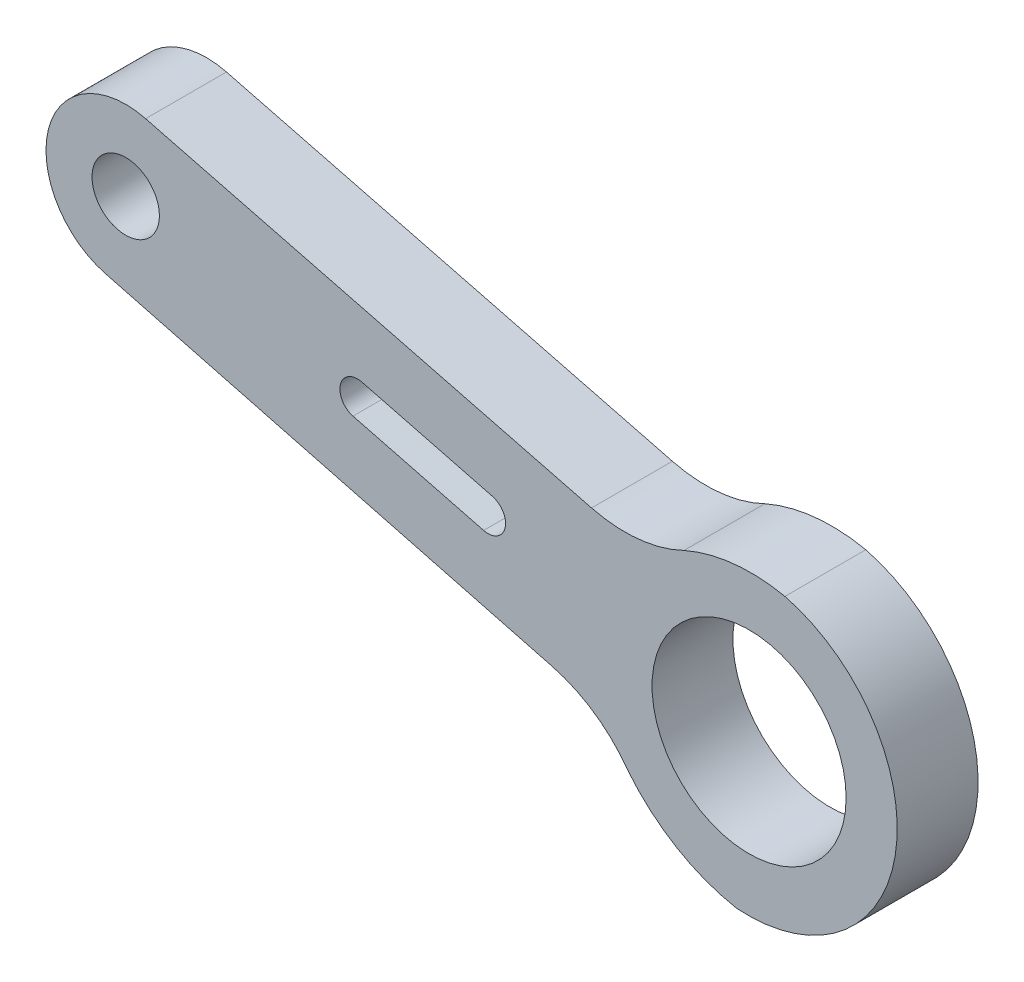
ISO-10303-21;
HEADER;
FILE_DESCRIPTION(('STEP AP214'),'2;1');
FILE_NAME('part.step','',(''),(''),'','','');
FILE_SCHEMA(('AUTOMOTIVE_DESIGN { 1 0 10303 214 1 1 1 1 }'));
ENDSEC;
DATA;
#1=APPLICATION_CONTEXT('core data for automotive mechanical design processes');
#2=APPLICATION_PROTOCOL_DEFINITION('international standard','automotive_design',2000,#1);
#3=PRODUCT_CONTEXT('',#1,'mechanical');
#4=PRODUCT('Part','Part','',(#3));
#5=PRODUCT_RELATED_PRODUCT_CATEGORY('part','',(#4));
#6=PRODUCT_DEFINITION_FORMATION('','',#4);
#7=PRODUCT_DEFINITION_CONTEXT('part definition',#1,'design');
#8=PRODUCT_DEFINITION('design','',#6,#7);
#9=PRODUCT_DEFINITION_SHAPE('','',#8);
#10=(LENGTH_UNIT() NAMED_UNIT(*) SI_UNIT(.MILLI.,.METRE.));
#11=(NAMED_UNIT(*) PLANE_ANGLE_UNIT() SI_UNIT($,.RADIAN.));
#12=(NAMED_UNIT(*) SI_UNIT($,.STERADIAN.) SOLID_ANGLE_UNIT());
#13=UNCERTAINTY_MEASURE_WITH_UNIT(LENGTH_MEASURE(1.E-05),#10,'distance_accuracy_value','');
#14=(GEOMETRIC_REPRESENTATION_CONTEXT(3) GLOBAL_UNCERTAINTY_ASSIGNED_CONTEXT((#13)) GLOBAL_UNIT_ASSIGNED_CONTEXT((#10,
#11,#12)) REPRESENTATION_CONTEXT('',''));
#15=CARTESIAN_POINT('',(0.,0.,0.));
#16=DIRECTION('',(0.,0.,1.));
#17=DIRECTION('',(1.,0.,0.));
#18=AXIS2_PLACEMENT_3D('',#15,#16,#17);
#19=CARTESIAN_POINT('',(262.893149615823,85.3209545811393,3.));
#20=DIRECTION('',(0.,0.,1.));
#21=DIRECTION('',(1.,0.,0.));
#22=AXIS2_PLACEMENT_3D('',#19,#20,#21);
#23=PLANE('',#22);
#24=DIRECTION('',(0.968336228734714,-0.249649650750469,0.));
#25=VECTOR('',#24,1.);
#26=CARTESIAN_POINT('',(252.804001409949,79.0029027766564,3.));
#27=LINE('',#26,#25);
#28=CARTESIAN_POINT('',(252.804001409949,79.0029027766564,3.));
#29=VERTEX_POINT('',#28);
#30=CARTESIAN_POINT('',(257.650550116745,77.7533996019402,3.));
#31=VERTEX_POINT('',#30);
#32=EDGE_CURVE('E130',#29,#31,#27,.T.);
#33=ORIENTED_EDGE('',*,*,#32,.F.);
#34=CARTESIAN_POINT('',(252.969255150284,79.6315451243434,3.));
#35=DIRECTION('',(0.,0.,1.));
#36=DIRECTION('',(1.,0.,0.));
#37=AXIS2_PLACEMENT_3D('',#34,#35,#36);
#38=CIRCLE('',#37,0.650000000000051);
#39=CARTESIAN_POINT('',(253.134508890618,80.2601874720305,3.));
#40=VERTEX_POINT('',#39);
#41=EDGE_CURVE('E122',#40,#29,#38,.T.);
#42=ORIENTED_EDGE('',*,*,#41,.F.);
#43=DIRECTION('',(-0.968336227980004,0.249649653677824,0.));
#44=VECTOR('',#43,1.);
#45=CARTESIAN_POINT('',(257.981059368998,79.0106838249517,3.));
#46=LINE('',#45,#44);
#47=CARTESIAN_POINT('',(257.981059368998,79.0106838249517,3.));
#48=VERTEX_POINT('',#47);
#49=EDGE_CURVE('E145',#48,#40,#46,.T.);
#50=ORIENTED_EDGE('',*,*,#49,.F.);
#51=CARTESIAN_POINT('',(257.815804742871,78.382041713446,3.));
#52=DIRECTION('',(0.,0.,1.));
#53=DIRECTION('',(1.,0.,0.));
#54=AXIS2_PLACEMENT_3D('',#51,#52,#53);
#55=CIRCLE('',#54,0.649999996780456);
#56=EDGE_CURVE('E143',#31,#48,#55,.T.);
#57=ORIENTED_EDGE('',*,*,#56,.F.);
#58=EDGE_LOOP('',(#33,#42,#50,#57));
#59=FACE_BOUND('',#58,.T.);
#60=CARTESIAN_POINT('',(267.499543018167,75.8854306088731,3.));
#61=DIRECTION('',(0.,0.,1.));
#62=DIRECTION('',(1.,0.,0.));
#63=AXIS2_PLACEMENT_3D('',#60,#61,#62);
#64=CIRCLE('',#63,3.60000000000001);
#65=CARTESIAN_POINT('',(271.099543018167,75.8854306088731,3.));
#66=VERTEX_POINT('',#65);
#67=EDGE_CURVE('E161',#66,#66,#64,.T.);
#68=ORIENTED_EDGE('',*,*,#67,.F.);
#69=EDGE_LOOP('',(#68));
#70=FACE_BOUND('',#69,.T.);
#71=CARTESIAN_POINT('',(262.893149615823,85.3209545811393,3.));
#72=DIRECTION('',(0.,0.,-1.));
#73=DIRECTION('',(1.,0.,0.));
#74=AXIS2_PLACEMENT_3D('',#71,#72,#73);
#75=CIRCLE('',#74,4.99988028430356);
#76=CARTESIAN_POINT('',(265.086550742752,80.8278716357938,3.));
#77=VERTEX_POINT('',#76);
#78=CARTESIAN_POINT('',(261.654207062286,80.4770074090076,3.));
#79=VERTEX_POINT('',#78);
#80=EDGE_CURVE('E167',#77,#79,#75,.T.);
#81=ORIENTED_EDGE('',*,*,#80,.T.);
#82=DIRECTION('',(-0.968768932380631,0.24796523073627,0.));
#83=VECTOR('',#82,1.);
#84=CARTESIAN_POINT('',(261.654207062286,80.4770074090076,3.));
#85=LINE('',#84,#83);
#86=CARTESIAN_POINT('',(245.112048776645,84.7111234701976,3.));
#87=VERTEX_POINT('',#86);
#88=EDGE_CURVE('E170',#79,#87,#85,.T.);
#89=ORIENTED_EDGE('',*,*,#88,.T.);
#90=CARTESIAN_POINT('',(244.373787068958,81.8475684181407,3.));
#91=DIRECTION('',(0.,0.,1.));
#92=DIRECTION('',(-1.,0.,0.));
#93=AXIS2_PLACEMENT_3D('',#90,#91,#92);
#94=CIRCLE('',#93,2.95719087736943);
#95=CARTESIAN_POINT('',(243.63552469051,78.984013539015,3.));
#96=VERTEX_POINT('',#95);
#97=EDGE_CURVE('E173',#87,#96,#94,.T.);
#98=ORIENTED_EDGE('',*,*,#97,.T.);
#99=DIRECTION('',(0.967514162567297,-0.252816821496717,0.));
#100=VECTOR('',#99,1.);
#101=CARTESIAN_POINT('',(243.63552469051,78.984013539015,3.));
#102=LINE('',#101,#100);
#103=CARTESIAN_POINT('',(260.167543030857,74.6641053749409,3.));
#104=VERTEX_POINT('',#103);
#105=EDGE_CURVE('E175',#96,#104,#102,.T.);
#106=ORIENTED_EDGE('',*,*,#105,.T.);
#107=CARTESIAN_POINT('',(258.928599023242,69.8200585315925,3.));
#108=DIRECTION('',(0.,0.,-1.));
#109=DIRECTION('',(1.,0.,0.));
#110=AXIS2_PLACEMENT_3D('',#107,#108,#109);
#111=CIRCLE('',#110,4.99997720740361);
#112=CARTESIAN_POINT('',(263.00998110044,72.7083265964513,3.));
#113=VERTEX_POINT('',#112);
#114=EDGE_CURVE('E177',#104,#113,#111,.T.);
#115=ORIENTED_EDGE('',*,*,#114,.T.);
#116=CARTESIAN_POINT('',(268.27348849085,76.951992882265,3.));
#117=DIRECTION('',(0.,0.,1.));
#118=DIRECTION('',(1.,0.,0.));
#119=AXIS2_PLACEMENT_3D('',#116,#117,#118);
#120=CIRCLE('',#119,6.7611547530171);
#121=CARTESIAN_POINT('',(267.027735224083,70.306595046726,3.));
#122=VERTEX_POINT('',#121);
#123=EDGE_CURVE('E179',#113,#122,#120,.T.);
#124=ORIENTED_EDGE('',*,*,#123,.T.);
#125=CARTESIAN_POINT('',(267.441397071041,75.8448272787794,3.));
#126=DIRECTION('',(0.,0.,1.));
#127=DIRECTION('',(1.,0.,0.));
#128=AXIS2_PLACEMENT_3D('',#125,#126,#127);
#129=CIRCLE('',#128,5.55365936836099);
#130=CARTESIAN_POINT('',(268.830075410294,81.2220660654592,3.));
#131=VERTEX_POINT('',#130);
#132=EDGE_CURVE('E181',#122,#131,#129,.T.);
#133=ORIENTED_EDGE('',*,*,#132,.T.);
#134=CARTESIAN_POINT('',(267.568291859667,75.2322167223997,3.));
#135=DIRECTION('',(0.,0.,1.));
#136=DIRECTION('',(1.,0.,0.));
#137=AXIS2_PLACEMENT_3D('',#134,#135,#136);
#138=CIRCLE('',#137,6.12130646849034);
#139=EDGE_CURVE('E183',#131,#77,#138,.T.);
#140=ORIENTED_EDGE('',*,*,#139,.T.);
#141=EDGE_LOOP('',(#81,#89,#98,#106,#115,#124,#133,#140));
#142=FACE_BOUND('',#141,.T.);
#143=CARTESIAN_POINT('',(244.373787095024,81.8475683954791,3.));
#144=DIRECTION('',(0.,0.,1.));
#145=DIRECTION('',(1.,0.,0.));
#146=AXIS2_PLACEMENT_3D('',#143,#144,#145);
#147=CIRCLE('',#146,1.25000000000001);
#148=CARTESIAN_POINT('',(245.623787095024,81.8475683954791,3.));
#149=VERTEX_POINT('',#148);
#150=EDGE_CURVE('E151',#149,#149,#147,.T.);
#151=ORIENTED_EDGE('',*,*,#150,.F.);
#152=EDGE_LOOP('',(#151));
#153=FACE_BOUND('',#152,.T.);
#154=ADVANCED_FACE('F33',(#59,#70,#142,#153),#23,.T.);
#155=CARTESIAN_POINT('',(262.893149615823,85.3209545811393,0.));
#156=DIRECTION('',(0.,0.,1.));
#157=DIRECTION('',(1.,0.,0.));
#158=AXIS2_PLACEMENT_3D('',#155,#156,#157);
#159=PLANE('',#158);
#160=CARTESIAN_POINT('',(267.499543018167,75.8854306088731,0.));
#161=DIRECTION('',(0.,0.,1.));
#162=DIRECTION('',(1.,0.,0.));
#163=AXIS2_PLACEMENT_3D('',#160,#161,#162);
#164=CIRCLE('',#163,3.60000000000001);
#165=CARTESIAN_POINT('',(271.099543018167,75.8854306088731,0.));
#166=VERTEX_POINT('',#165);
#167=EDGE_CURVE('E138',#166,#166,#164,.T.);
#168=ORIENTED_EDGE('',*,*,#167,.T.);
#169=EDGE_LOOP('',(#168));
#170=FACE_BOUND('',#169,.T.);
#171=CARTESIAN_POINT('',(262.893149615823,85.3209545811393,0.));
#172=DIRECTION('',(0.,0.,-1.));
#173=DIRECTION('',(1.,0.,0.));
#174=AXIS2_PLACEMENT_3D('',#171,#172,#173);
#175=CIRCLE('',#174,4.99988028430356);
#176=CARTESIAN_POINT('',(265.086550742752,80.8278716357938,0.));
#177=VERTEX_POINT('',#176);
#178=CARTESIAN_POINT('',(261.654207062286,80.4770074090076,0.));
#179=VERTEX_POINT('',#178);
#180=EDGE_CURVE('E164',#177,#179,#175,.T.);
#181=ORIENTED_EDGE('',*,*,#180,.F.);
#182=CARTESIAN_POINT('',(267.568291859667,75.2322167223997,0.));
#183=DIRECTION('',(0.,0.,1.));
#184=DIRECTION('',(1.,0.,0.));
#185=AXIS2_PLACEMENT_3D('',#182,#183,#184);
#186=CIRCLE('',#185,6.12130646849034);
#187=CARTESIAN_POINT('',(268.830075410294,81.2220660654592,0.));
#188=VERTEX_POINT('',#187);
#189=EDGE_CURVE('E171',#188,#177,#186,.T.);
#190=ORIENTED_EDGE('',*,*,#189,.F.);
#191=CARTESIAN_POINT('',(267.441397085972,75.8448269153171,0.));
#192=DIRECTION('',(0.,0.,1.));
#193=DIRECTION('',(-1.,0.,0.));
#194=AXIS2_PLACEMENT_3D('',#191,#192,#193);
#195=CIRCLE('',#194,5.55365900702066);
#196=CARTESIAN_POINT('',(267.027735224083,70.306595046726,0.));
#197=VERTEX_POINT('',#196);
#198=EDGE_CURVE('E199',#197,#188,#195,.T.);
#199=ORIENTED_EDGE('',*,*,#198,.F.);
#200=CARTESIAN_POINT('',(268.27348849085,76.951992882265,0.));
#201=DIRECTION('',(0.,0.,1.));
#202=DIRECTION('',(1.,0.,0.));
#203=AXIS2_PLACEMENT_3D('',#200,#201,#202);
#204=CIRCLE('',#203,6.7611547530171);
#205=CARTESIAN_POINT('',(263.00998110044,72.7083265964513,0.));
#206=VERTEX_POINT('',#205);
#207=EDGE_CURVE('E196',#206,#197,#204,.T.);
#208=ORIENTED_EDGE('',*,*,#207,.F.);
#209=CARTESIAN_POINT('',(258.928599023242,69.8200585315925,0.));
#210=DIRECTION('',(0.,0.,-1.));
#211=DIRECTION('',(1.,0.,0.));
#212=AXIS2_PLACEMENT_3D('',#209,#210,#211);
#213=CIRCLE('',#212,4.99997720740361);
#214=CARTESIAN_POINT('',(260.167543030857,74.6641053749409,0.));
#215=VERTEX_POINT('',#214);
#216=EDGE_CURVE('E194',#215,#206,#213,.T.);
#217=ORIENTED_EDGE('',*,*,#216,.F.);
#218=DIRECTION('',(0.967514162567297,-0.252816821496717,0.));
#219=VECTOR('',#218,1.);
#220=CARTESIAN_POINT('',(243.63552469051,78.984013539015,0.));
#221=LINE('',#220,#219);
#222=CARTESIAN_POINT('',(243.63552469051,78.984013539015,0.));
#223=VERTEX_POINT('',#222);
#224=EDGE_CURVE('E192',#223,#215,#221,.T.);
#225=ORIENTED_EDGE('',*,*,#224,.F.);
#226=CARTESIAN_POINT('',(244.373787068958,81.8475684181407,0.));
#227=DIRECTION('',(0.,0.,1.));
#228=DIRECTION('',(-1.,0.,0.));
#229=AXIS2_PLACEMENT_3D('',#226,#227,#228);
#230=CIRCLE('',#229,2.95719087736943);
#231=CARTESIAN_POINT('',(245.112048776645,84.7111234701976,0.));
#232=VERTEX_POINT('',#231);
#233=EDGE_CURVE('E190',#232,#223,#230,.T.);
#234=ORIENTED_EDGE('',*,*,#233,.F.);
#235=DIRECTION('',(-0.968768932380631,0.24796523073627,0.));
#236=VECTOR('',#235,1.);
#237=CARTESIAN_POINT('',(261.654207062286,80.4770074090076,0.));
#238=LINE('',#237,#236);
#239=EDGE_CURVE('E188',#179,#232,#238,.T.);
#240=ORIENTED_EDGE('',*,*,#239,.F.);
#241=EDGE_LOOP('',(#181,#190,#199,#208,#217,#225,#234,#240));
#242=FACE_BOUND('',#241,.T.);
#243=CARTESIAN_POINT('',(252.969255150284,79.6315451243434,0.));
#244=DIRECTION('',(0.,0.,1.));
#245=DIRECTION('',(1.,0.,0.));
#246=AXIS2_PLACEMENT_3D('',#243,#244,#245);
#247=CIRCLE('',#246,0.650000000000051);
#248=CARTESIAN_POINT('',(253.134508890618,80.2601874720305,0.));
#249=VERTEX_POINT('',#248);
#250=CARTESIAN_POINT('',(252.804001409949,79.0029027766564,0.));
#251=VERTEX_POINT('',#250);
#252=EDGE_CURVE('E56',#249,#251,#247,.T.);
#253=ORIENTED_EDGE('',*,*,#252,.T.);
#254=DIRECTION('',(0.968336228734714,-0.249649650750469,0.));
#255=VECTOR('',#254,1.);
#256=CARTESIAN_POINT('',(252.804001409949,79.0029027766564,0.));
#257=LINE('',#256,#255);
#258=CARTESIAN_POINT('',(257.650550116745,77.7533996019402,0.));
#259=VERTEX_POINT('',#258);
#260=EDGE_CURVE('E137',#251,#259,#257,.T.);
#261=ORIENTED_EDGE('',*,*,#260,.T.);
#262=CARTESIAN_POINT('',(257.815804742871,78.382041713446,0.));
#263=DIRECTION('',(0.,0.,1.));
#264=DIRECTION('',(1.,0.,0.));
#265=AXIS2_PLACEMENT_3D('',#262,#263,#264);
#266=CIRCLE('',#265,0.649999996780456);
#267=CARTESIAN_POINT('',(257.981059368998,79.0106838249517,0.));
#268=VERTEX_POINT('',#267);
#269=EDGE_CURVE('E153',#259,#268,#266,.T.);
#270=ORIENTED_EDGE('',*,*,#269,.T.);
#271=DIRECTION('',(-0.968336227980004,0.249649653677824,0.));
#272=VECTOR('',#271,1.);
#273=CARTESIAN_POINT('',(257.981059368998,79.0106838249517,0.));
#274=LINE('',#273,#272);
#275=EDGE_CURVE('E131',#268,#249,#274,.T.);
#276=ORIENTED_EDGE('',*,*,#275,.T.);
#277=EDGE_LOOP('',(#253,#261,#270,#276));
#278=FACE_BOUND('',#277,.T.);
#279=CARTESIAN_POINT('',(244.373787095024,81.8475683954791,0.));
#280=DIRECTION('',(0.,0.,1.));
#281=DIRECTION('',(1.,0.,0.));
#282=AXIS2_PLACEMENT_3D('',#279,#280,#281);
#283=CIRCLE('',#282,1.25000000000001);
#284=CARTESIAN_POINT('',(245.623787095024,81.8475683954791,0.));
#285=VERTEX_POINT('',#284);
#286=EDGE_CURVE('E312',#285,#285,#283,.T.);
#287=ORIENTED_EDGE('',*,*,#286,.T.);
#288=EDGE_LOOP('',(#287));
#289=FACE_BOUND('',#288,.T.);
#290=ADVANCED_FACE('F229',(#170,#242,#278,#289),#159,.F.);
#291=CARTESIAN_POINT('',(262.893149615823,85.3209545811393,3.));
#292=DIRECTION('',(0.,0.,-1.));
#293=DIRECTION('',(-1.,0.,0.));
#294=AXIS2_PLACEMENT_3D('',#291,#292,#293);
#295=CYLINDRICAL_SURFACE('',#294,4.99988028430356);
#296=ORIENTED_EDGE('',*,*,#180,.T.);
#297=DIRECTION('',(0.,0.,-1.));
#298=VECTOR('',#297,1.);
#299=CARTESIAN_POINT('',(261.654207062286,80.4770074090076,3.));
#300=LINE('',#299,#298);
#301=EDGE_CURVE('E11',#79,#179,#300,.T.);
#302=ORIENTED_EDGE('',*,*,#301,.F.);
#303=ORIENTED_EDGE('',*,*,#80,.F.);
#304=DIRECTION('',(0.,0.,-1.));
#305=VECTOR('',#304,1.);
#306=CARTESIAN_POINT('',(265.086550742752,80.8278716357938,3.));
#307=LINE('',#306,#305);
#308=EDGE_CURVE('E185',#77,#177,#307,.T.);
#309=ORIENTED_EDGE('',*,*,#308,.T.);
#310=EDGE_LOOP('',(#296,#302,#303,#309));
#311=FACE_BOUND('',#310,.T.);
#312=ADVANCED_FACE('F35',(#311),#295,.F.);
#313=CARTESIAN_POINT('',(261.654207062286,80.4770074090076,3.));
#314=DIRECTION('',(-0.24796523073627,-0.968768932380631,0.));
#315=DIRECTION('',(0.968768932380631,-0.24796523073627,0.));
#316=AXIS2_PLACEMENT_3D('',#313,#314,#315);
#317=PLANE('',#316);
#318=ORIENTED_EDGE('',*,*,#239,.T.);
#319=DIRECTION('',(0.,0.,-1.));
#320=VECTOR('',#319,1.);
#321=CARTESIAN_POINT('',(245.112048776645,84.7111234701976,3.));
#322=LINE('',#321,#320);
#323=EDGE_CURVE('E41',#87,#232,#322,.T.);
#324=ORIENTED_EDGE('',*,*,#323,.F.);
#325=ORIENTED_EDGE('',*,*,#88,.F.);
#326=ORIENTED_EDGE('',*,*,#301,.T.);
#327=EDGE_LOOP('',(#318,#324,#325,#326));
#328=FACE_BOUND('',#327,.T.);
#329=ADVANCED_FACE('F247',(#328),#317,.F.);
#330=CARTESIAN_POINT('',(244.373787068958,81.8475684181407,3.));
#331=DIRECTION('',(0.,0.,-1.));
#332=DIRECTION('',(-1.,0.,0.));
#333=AXIS2_PLACEMENT_3D('',#330,#331,#332);
#334=CYLINDRICAL_SURFACE('',#333,2.95719087736943);
#335=ORIENTED_EDGE('',*,*,#233,.T.);
#336=DIRECTION('',(0.,0.,-1.));
#337=VECTOR('',#336,1.);
#338=CARTESIAN_POINT('',(243.63552469051,78.984013539015,3.));
#339=LINE('',#338,#337);
#340=EDGE_CURVE('E216',#96,#223,#339,.T.);
#341=ORIENTED_EDGE('',*,*,#340,.F.);
#342=ORIENTED_EDGE('',*,*,#97,.F.);
#343=ORIENTED_EDGE('',*,*,#323,.T.);
#344=EDGE_LOOP('',(#335,#341,#342,#343));
#345=FACE_BOUND('',#344,.T.);
#346=ADVANCED_FACE('F223',(#345),#334,.T.);
#347=CARTESIAN_POINT('',(243.63552469051,78.984013539015,3.));
#348=DIRECTION('',(0.252816821496717,0.967514162567296,0.));
#349=DIRECTION('',(-0.967514162567297,0.252816821496717,0.));
#350=AXIS2_PLACEMENT_3D('',#347,#348,#349);
#351=PLANE('',#350);
#352=ORIENTED_EDGE('',*,*,#224,.T.);
#353=DIRECTION('',(0.,0.,-1.));
#354=VECTOR('',#353,1.);
#355=CARTESIAN_POINT('',(260.167543030857,74.6641053749409,3.));
#356=LINE('',#355,#354);
#357=EDGE_CURVE('E213',#104,#215,#356,.T.);
#358=ORIENTED_EDGE('',*,*,#357,.F.);
#359=ORIENTED_EDGE('',*,*,#105,.F.);
#360=ORIENTED_EDGE('',*,*,#340,.T.);
#361=EDGE_LOOP('',(#352,#358,#359,#360));
#362=FACE_BOUND('',#361,.T.);
#363=ADVANCED_FACE('F235',(#362),#351,.F.);
#364=CARTESIAN_POINT('',(258.928599023242,69.8200585315925,3.));
#365=DIRECTION('',(0.,0.,-1.));
#366=DIRECTION('',(-1.,0.,0.));
#367=AXIS2_PLACEMENT_3D('',#364,#365,#366);
#368=CYLINDRICAL_SURFACE('',#367,4.99997720740361);
#369=ORIENTED_EDGE('',*,*,#216,.T.);
#370=DIRECTION('',(0.,0.,-1.));
#371=VECTOR('',#370,1.);
#372=CARTESIAN_POINT('',(263.00998110044,72.7083265964513,3.));
#373=LINE('',#372,#371);
#374=EDGE_CURVE('E210',#113,#206,#373,.T.);
#375=ORIENTED_EDGE('',*,*,#374,.F.);
#376=ORIENTED_EDGE('',*,*,#114,.F.);
#377=ORIENTED_EDGE('',*,*,#357,.T.);
#378=EDGE_LOOP('',(#369,#375,#376,#377));
#379=FACE_BOUND('',#378,.T.);
#380=ADVANCED_FACE('F239',(#379),#368,.F.);
#381=CARTESIAN_POINT('',(268.27348849085,76.951992882265,3.));
#382=DIRECTION('',(0.,0.,-1.));
#383=DIRECTION('',(-1.,0.,0.));
#384=AXIS2_PLACEMENT_3D('',#381,#382,#383);
#385=CYLINDRICAL_SURFACE('',#384,6.7611547530171);
#386=ORIENTED_EDGE('',*,*,#207,.T.);
#387=DIRECTION('',(0.,0.,-1.));
#388=VECTOR('',#387,1.);
#389=CARTESIAN_POINT('',(267.027735224083,70.306595046726,3.));
#390=LINE('',#389,#388);
#391=EDGE_CURVE('E207',#122,#197,#390,.T.);
#392=ORIENTED_EDGE('',*,*,#391,.F.);
#393=ORIENTED_EDGE('',*,*,#123,.F.);
#394=ORIENTED_EDGE('',*,*,#374,.T.);
#395=EDGE_LOOP('',(#386,#392,#393,#394));
#396=FACE_BOUND('',#395,.T.);
#397=ADVANCED_FACE('F259',(#396),#385,.T.);
#398=CARTESIAN_POINT('',(267.441397085972,75.8448269153171,3.));
#399=DIRECTION('',(0.,0.,-1.));
#400=DIRECTION('',(-1.,0.,0.));
#401=AXIS2_PLACEMENT_3D('',#398,#399,#400);
#402=CYLINDRICAL_SURFACE('',#401,5.55365900702066);
#403=ORIENTED_EDGE('',*,*,#198,.T.);
#404=DIRECTION('',(0.,0.,-1.));
#405=VECTOR('',#404,1.);
#406=CARTESIAN_POINT('',(268.830075410294,81.2220660654592,3.));
#407=LINE('',#406,#405);
#408=EDGE_CURVE('E204',#131,#188,#407,.T.);
#409=ORIENTED_EDGE('',*,*,#408,.F.);
#410=ORIENTED_EDGE('',*,*,#132,.F.);
#411=ORIENTED_EDGE('',*,*,#391,.T.);
#412=EDGE_LOOP('',(#403,#409,#410,#411));
#413=FACE_BOUND('',#412,.T.);
#414=ADVANCED_FACE('F257',(#413),#402,.T.);
#415=CARTESIAN_POINT('',(267.568291859667,75.2322167223997,3.));
#416=DIRECTION('',(0.,0.,-1.));
#417=DIRECTION('',(-1.,0.,0.));
#418=AXIS2_PLACEMENT_3D('',#415,#416,#417);
#419=CYLINDRICAL_SURFACE('',#418,6.12130646849034);
#420=ORIENTED_EDGE('',*,*,#189,.T.);
#421=ORIENTED_EDGE('',*,*,#308,.F.);
#422=ORIENTED_EDGE('',*,*,#139,.F.);
#423=ORIENTED_EDGE('',*,*,#408,.T.);
#424=EDGE_LOOP('',(#420,#421,#422,#423));
#425=FACE_BOUND('',#424,.T.);
#426=ADVANCED_FACE('F252',(#425),#419,.T.);
#427=CARTESIAN_POINT('',(267.499543018167,75.8854306088731,3.));
#428=DIRECTION('',(0.,0.,-1.));
#429=DIRECTION('',(-1.,0.,0.));
#430=AXIS2_PLACEMENT_3D('',#427,#428,#429);
#431=CYLINDRICAL_SURFACE('',#430,3.60000000000001);
#432=ORIENTED_EDGE('',*,*,#67,.T.);
#433=EDGE_LOOP('',(#432));
#434=FACE_BOUND('',#433,.T.);
#435=ORIENTED_EDGE('',*,*,#167,.F.);
#436=EDGE_LOOP('',(#435));
#437=FACE_BOUND('',#436,.T.);
#438=ADVANCED_FACE('F276',(#434,#437),#431,.F.);
#439=CARTESIAN_POINT('',(252.969255150284,79.6315451243434,3.));
#440=DIRECTION('',(0.,0.,-1.));
#441=DIRECTION('',(-1.,0.,0.));
#442=AXIS2_PLACEMENT_3D('',#439,#440,#441);
#443=CYLINDRICAL_SURFACE('',#442,0.650000000000051);
#444=ORIENTED_EDGE('',*,*,#252,.F.);
#445=DIRECTION('',(0.,0.,-1.));
#446=VECTOR('',#445,1.);
#447=CARTESIAN_POINT('',(253.134508890618,80.2601874720305,3.));
#448=LINE('',#447,#446);
#449=EDGE_CURVE('E126',#40,#249,#448,.T.);
#450=ORIENTED_EDGE('',*,*,#449,.F.);
#451=ORIENTED_EDGE('',*,*,#41,.T.);
#452=DIRECTION('',(0.,0.,-1.));
#453=VECTOR('',#452,1.);
#454=CARTESIAN_POINT('',(252.804001409949,79.0029027766564,3.));
#455=LINE('',#454,#453);
#456=EDGE_CURVE('E125',#29,#251,#455,.T.);
#457=ORIENTED_EDGE('',*,*,#456,.T.);
#458=EDGE_LOOP('',(#444,#450,#451,#457));
#459=FACE_BOUND('',#458,.T.);
#460=ADVANCED_FACE('F124',(#459),#443,.F.);
#461=CARTESIAN_POINT('',(252.804001409949,79.0029027766564,3.));
#462=DIRECTION('',(0.249649650750469,0.968336228734714,0.));
#463=DIRECTION('',(-0.968336228734714,0.249649650750469,0.));
#464=AXIS2_PLACEMENT_3D('',#461,#462,#463);
#465=PLANE('',#464);
#466=ORIENTED_EDGE('',*,*,#260,.F.);
#467=ORIENTED_EDGE('',*,*,#456,.F.);
#468=ORIENTED_EDGE('',*,*,#32,.T.);
#469=DIRECTION('',(0.,0.,-1.));
#470=VECTOR('',#469,1.);
#471=CARTESIAN_POINT('',(257.650550116745,77.7533996019402,3.));
#472=LINE('',#471,#470);
#473=EDGE_CURVE('E139',#31,#259,#472,.T.);
#474=ORIENTED_EDGE('',*,*,#473,.T.);
#475=EDGE_LOOP('',(#466,#467,#468,#474));
#476=FACE_BOUND('',#475,.T.);
#477=ADVANCED_FACE('F134',(#476),#465,.T.);
#478=CARTESIAN_POINT('',(257.815804742871,78.382041713446,3.));
#479=DIRECTION('',(0.,0.,-1.));
#480=DIRECTION('',(-1.,0.,0.));
#481=AXIS2_PLACEMENT_3D('',#478,#479,#480);
#482=CYLINDRICAL_SURFACE('',#481,0.649999996780456);
#483=ORIENTED_EDGE('',*,*,#269,.F.);
#484=ORIENTED_EDGE('',*,*,#473,.F.);
#485=ORIENTED_EDGE('',*,*,#56,.T.);
#486=DIRECTION('',(0.,0.,-1.));
#487=VECTOR('',#486,1.);
#488=CARTESIAN_POINT('',(257.981059368998,79.0106838249517,3.));
#489=LINE('',#488,#487);
#490=EDGE_CURVE('E48',#48,#268,#489,.T.);
#491=ORIENTED_EDGE('',*,*,#490,.T.);
#492=EDGE_LOOP('',(#483,#484,#485,#491));
#493=FACE_BOUND('',#492,.T.);
#494=ADVANCED_FACE('F293',(#493),#482,.F.);
#495=CARTESIAN_POINT('',(257.981059368998,79.0106838249517,3.));
#496=DIRECTION('',(-0.249649653677824,-0.968336227980004,0.));
#497=DIRECTION('',(0.968336227980004,-0.249649653677824,0.));
#498=AXIS2_PLACEMENT_3D('',#495,#496,#497);
#499=PLANE('',#498);
#500=ORIENTED_EDGE('',*,*,#275,.F.);
#501=ORIENTED_EDGE('',*,*,#490,.F.);
#502=ORIENTED_EDGE('',*,*,#49,.T.);
#503=ORIENTED_EDGE('',*,*,#449,.T.);
#504=EDGE_LOOP('',(#500,#501,#502,#503));
#505=FACE_BOUND('',#504,.T.);
#506=ADVANCED_FACE('F298',(#505),#499,.T.);
#507=CARTESIAN_POINT('',(244.373787095024,81.8475683954791,3.));
#508=DIRECTION('',(0.,0.,-1.));
#509=DIRECTION('',(-1.,0.,0.));
#510=AXIS2_PLACEMENT_3D('',#507,#508,#509);
#511=CYLINDRICAL_SURFACE('',#510,1.25000000000001);
#512=ORIENTED_EDGE('',*,*,#150,.T.);
#513=EDGE_LOOP('',(#512));
#514=FACE_BOUND('',#513,.T.);
#515=ORIENTED_EDGE('',*,*,#286,.F.);
#516=EDGE_LOOP('',(#515));
#517=FACE_BOUND('',#516,.T.);
#518=ADVANCED_FACE('F302',(#514,#517),#511,.F.);
#519=CLOSED_SHELL('',(#154,#290,#312,#329,#346,#363,#380,#397,#414,#426,#438,#460,#477,#494,
#506,#518));
#520=MANIFOLD_SOLID_BREP('B2',#519);
#521=ADVANCED_BREP_SHAPE_REPRESENTATION('',(#18,#520),#14);
#522=SHAPE_DEFINITION_REPRESENTATION(#9,#521);
ENDSEC;
END-ISO-10303-21;
